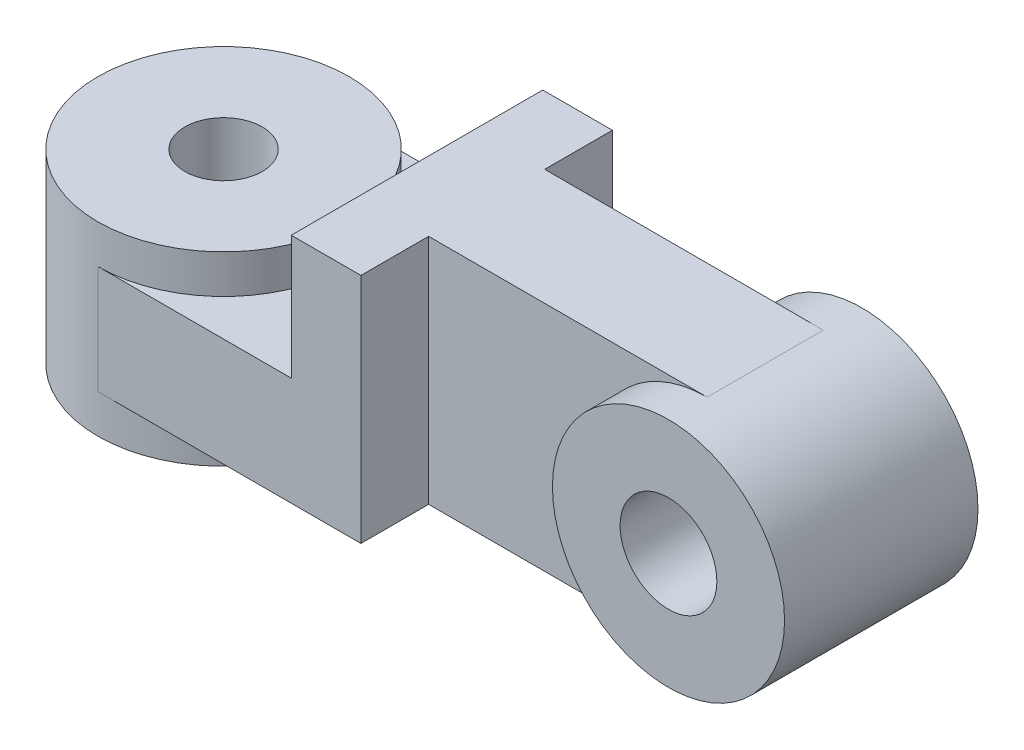
ISO-10303-21;
HEADER;
FILE_DESCRIPTION(('STEP AP214'),'2;1');
FILE_NAME('part.step','',(''),(''),'','','');
FILE_SCHEMA(('AUTOMOTIVE_DESIGN { 1 0 10303 214 1 1 1 1 }'));
ENDSEC;
DATA;
#1=APPLICATION_CONTEXT('core data for automotive mechanical design processes');
#2=APPLICATION_PROTOCOL_DEFINITION('international standard','automotive_design',2000,#1);
#3=PRODUCT_CONTEXT('',#1,'mechanical');
#4=PRODUCT('Part','Part','',(#3));
#5=PRODUCT_RELATED_PRODUCT_CATEGORY('part','',(#4));
#6=PRODUCT_DEFINITION_FORMATION('','',#4);
#7=PRODUCT_DEFINITION_CONTEXT('part definition',#1,'design');
#8=PRODUCT_DEFINITION('design','',#6,#7);
#9=PRODUCT_DEFINITION_SHAPE('','',#8);
#10=(LENGTH_UNIT() NAMED_UNIT(*) SI_UNIT(.MILLI.,.METRE.));
#11=(NAMED_UNIT(*) PLANE_ANGLE_UNIT() SI_UNIT($,.RADIAN.));
#12=(NAMED_UNIT(*) SI_UNIT($,.STERADIAN.) SOLID_ANGLE_UNIT());
#13=UNCERTAINTY_MEASURE_WITH_UNIT(LENGTH_MEASURE(1.E-05),#10,'distance_accuracy_value','');
#14=(GEOMETRIC_REPRESENTATION_CONTEXT(3) GLOBAL_UNCERTAINTY_ASSIGNED_CONTEXT((#13)) GLOBAL_UNIT_ASSIGNED_CONTEXT((#10,
#11,#12)) REPRESENTATION_CONTEXT('',''));
#15=CARTESIAN_POINT('',(0.,0.,0.));
#16=DIRECTION('',(0.,0.,1.));
#17=DIRECTION('',(1.,0.,0.));
#18=AXIS2_PLACEMENT_3D('',#15,#16,#17);
#19=CARTESIAN_POINT('',(0.,0.,32.5));
#20=DIRECTION('',(1.,0.,0.));
#21=DIRECTION('',(0.,1.,0.));
#22=AXIS2_PLACEMENT_3D('',#19,#20,#21);
#23=PLANE('',#22);
#24=DIRECTION('',(0.,0.,-1.));
#25=VECTOR('',#24,1.);
#26=CARTESIAN_POINT('',(0.,60.,32.5));
#27=LINE('',#26,#25);
#28=CARTESIAN_POINT('',(0.,60.,-15.));
#29=VERTEX_POINT('',#28);
#30=CARTESIAN_POINT('',(0.,60.,-32.5));
#31=VERTEX_POINT('',#30);
#32=EDGE_CURVE('E56',#29,#31,#27,.T.);
#33=ORIENTED_EDGE('',*,*,#32,.F.);
#34=DIRECTION('',(0.,-1.,0.));
#35=VECTOR('',#34,1.);
#36=CARTESIAN_POINT('',(0.,0.,-15.));
#37=LINE('',#36,#35);
#38=CARTESIAN_POINT('',(0.,0.,-15.));
#39=VERTEX_POINT('',#38);
#40=EDGE_CURVE('E51',#29,#39,#37,.T.);
#41=ORIENTED_EDGE('',*,*,#40,.T.);
#42=DIRECTION('',(0.,0.,-1.));
#43=VECTOR('',#42,1.);
#44=CARTESIAN_POINT('',(0.,0.,32.5));
#45=LINE('',#44,#43);
#46=CARTESIAN_POINT('',(0.,0.,-32.5));
#47=VERTEX_POINT('',#46);
#48=EDGE_CURVE('E182',#39,#47,#45,.T.);
#49=ORIENTED_EDGE('',*,*,#48,.T.);
#50=DIRECTION('',(0.,-1.,0.));
#51=VECTOR('',#50,1.);
#52=CARTESIAN_POINT('',(0.,0.,-32.5));
#53=LINE('',#52,#51);
#54=EDGE_CURVE('E163',#31,#47,#53,.T.);
#55=ORIENTED_EDGE('',*,*,#54,.F.);
#56=EDGE_LOOP('',(#33,#41,#49,#55));
#57=FACE_BOUND('',#56,.T.);
#58=ADVANCED_FACE('F35',(#57),#23,.T.);
#59=CARTESIAN_POINT('',(0.,0.,32.5));
#60=DIRECTION('',(0.,-1.,0.));
#61=DIRECTION('',(0.,0.,-1.));
#62=AXIS2_PLACEMENT_3D('',#59,#60,#61);
#63=PLANE('',#62);
#64=CARTESIAN_POINT('',(-68.,0.,0.));
#65=DIRECTION('',(0.,-1.,0.));
#66=DIRECTION('',(0.,0.,-1.));
#67=AXIS2_PLACEMENT_3D('',#64,#65,#66);
#68=CIRCLE('',#67,32.5);
#69=CARTESIAN_POINT('',(-68.,0.,-32.5));
#70=VERTEX_POINT('',#69);
#71=CARTESIAN_POINT('',(-68.,0.,32.5));
#72=VERTEX_POINT('',#71);
#73=EDGE_CURVE('E136',#70,#72,#68,.T.);
#74=ORIENTED_EDGE('',*,*,#73,.F.);
#75=DIRECTION('',(-1.,0.,0.));
#76=VECTOR('',#75,1.);
#77=CARTESIAN_POINT('',(0.,0.,-32.5));
#78=LINE('',#77,#76);
#79=EDGE_CURVE('E141',#47,#70,#78,.T.);
#80=ORIENTED_EDGE('',*,*,#79,.F.);
#81=ORIENTED_EDGE('',*,*,#48,.F.);
#82=DIRECTION('',(-1.,0.,0.));
#83=VECTOR('',#82,1.);
#84=CARTESIAN_POINT('',(0.,0.,-15.));
#85=LINE('',#84,#83);
#86=CARTESIAN_POINT('',(72.,0.,-15.));
#87=VERTEX_POINT('',#86);
#88=EDGE_CURVE('E132',#87,#39,#85,.T.);
#89=ORIENTED_EDGE('',*,*,#88,.F.);
#90=DIRECTION('',(0.,0.,-1.));
#91=VECTOR('',#90,1.);
#92=CARTESIAN_POINT('',(72.,0.,15.));
#93=LINE('',#92,#91);
#94=CARTESIAN_POINT('',(72.,0.,15.));
#95=VERTEX_POINT('',#94);
#96=EDGE_CURVE('E115',#95,#87,#93,.T.);
#97=ORIENTED_EDGE('',*,*,#96,.F.);
#98=DIRECTION('',(-1.,0.,0.));
#99=VECTOR('',#98,1.);
#100=CARTESIAN_POINT('',(0.,0.,15.));
#101=LINE('',#100,#99);
#102=CARTESIAN_POINT('',(0.,0.,15.));
#103=VERTEX_POINT('',#102);
#104=EDGE_CURVE('E134',#95,#103,#101,.T.);
#105=ORIENTED_EDGE('',*,*,#104,.T.);
#106=CARTESIAN_POINT('',(0.,0.,32.5));
#107=VERTEX_POINT('',#106);
#108=EDGE_CURVE('E44',#107,#103,#45,.T.);
#109=ORIENTED_EDGE('',*,*,#108,.F.);
#110=DIRECTION('',(-1.,0.,0.));
#111=VECTOR('',#110,1.);
#112=CARTESIAN_POINT('',(0.,0.,32.5));
#113=LINE('',#112,#111);
#114=EDGE_CURVE('E142',#107,#72,#113,.T.);
#115=ORIENTED_EDGE('',*,*,#114,.T.);
#116=EDGE_LOOP('',(#74,#80,#81,#89,#97,#105,#109,#115));
#117=FACE_BOUND('',#116,.T.);
#118=ADVANCED_FACE('F37',(#117),#63,.T.);
#119=DIRECTION('',(0.,-1.,0.));
#120=VECTOR('',#119,1.);
#121=CARTESIAN_POINT('',(0.,0.,15.));
#122=LINE('',#121,#120);
#123=CARTESIAN_POINT('',(0.,60.,15.));
#124=VERTEX_POINT('',#123);
#125=EDGE_CURVE('E129',#124,#103,#122,.T.);
#126=ORIENTED_EDGE('',*,*,#125,.F.);
#127=CARTESIAN_POINT('',(0.,60.,32.5));
#128=VERTEX_POINT('',#127);
#129=EDGE_CURVE('E180',#128,#124,#27,.T.);
#130=ORIENTED_EDGE('',*,*,#129,.F.);
#131=DIRECTION('',(0.,-1.,0.));
#132=VECTOR('',#131,1.);
#133=CARTESIAN_POINT('',(0.,0.,32.5));
#134=LINE('',#133,#132);
#135=EDGE_CURVE('E145',#128,#107,#134,.T.);
#136=ORIENTED_EDGE('',*,*,#135,.T.);
#137=ORIENTED_EDGE('',*,*,#108,.T.);
#138=EDGE_LOOP('',(#126,#130,#136,#137));
#139=FACE_BOUND('',#138,.T.);
#140=ADVANCED_FACE('F217',(#139),#23,.T.);
#141=CARTESIAN_POINT('',(0.,60.,32.5));
#142=DIRECTION('',(0.,1.,0.));
#143=DIRECTION('',(0.,0.,1.));
#144=AXIS2_PLACEMENT_3D('',#141,#142,#143);
#145=PLANE('',#144);
#146=DIRECTION('',(1.,0.,0.));
#147=VECTOR('',#146,1.);
#148=CARTESIAN_POINT('',(0.,60.,-32.5));
#149=LINE('',#148,#147);
#150=CARTESIAN_POINT('',(-18.,60.,-32.5));
#151=VERTEX_POINT('',#150);
#152=EDGE_CURVE('E166',#151,#31,#149,.T.);
#153=ORIENTED_EDGE('',*,*,#152,.F.);
#154=DIRECTION('',(0.,0.,-1.));
#155=VECTOR('',#154,1.);
#156=CARTESIAN_POINT('',(-18.,60.,32.5));
#157=LINE('',#156,#155);
#158=CARTESIAN_POINT('',(-18.,60.,32.5));
#159=VERTEX_POINT('',#158);
#160=EDGE_CURVE('E178',#159,#151,#157,.T.);
#161=ORIENTED_EDGE('',*,*,#160,.F.);
#162=DIRECTION('',(1.,0.,0.));
#163=VECTOR('',#162,1.);
#164=CARTESIAN_POINT('',(0.,60.,32.5));
#165=LINE('',#164,#163);
#166=EDGE_CURVE('E149',#159,#128,#165,.T.);
#167=ORIENTED_EDGE('',*,*,#166,.T.);
#168=ORIENTED_EDGE('',*,*,#129,.T.);
#169=DIRECTION('',(1.,0.,0.));
#170=VECTOR('',#169,1.);
#171=CARTESIAN_POINT('',(0.,60.,15.));
#172=LINE('',#171,#170);
#173=CARTESIAN_POINT('',(72.,60.,15.));
#174=VERTEX_POINT('',#173);
#175=EDGE_CURVE('E128',#124,#174,#172,.T.);
#176=ORIENTED_EDGE('',*,*,#175,.T.);
#177=DIRECTION('',(0.,0.,-1.));
#178=VECTOR('',#177,1.);
#179=CARTESIAN_POINT('',(72.,60.,15.));
#180=LINE('',#179,#178);
#181=CARTESIAN_POINT('',(72.,60.,-15.));
#182=VERTEX_POINT('',#181);
#183=EDGE_CURVE('E112',#174,#182,#180,.T.);
#184=ORIENTED_EDGE('',*,*,#183,.T.);
#185=DIRECTION('',(1.,0.,0.));
#186=VECTOR('',#185,1.);
#187=CARTESIAN_POINT('',(0.,60.,-15.));
#188=LINE('',#187,#186);
#189=EDGE_CURVE('E125',#29,#182,#188,.T.);
#190=ORIENTED_EDGE('',*,*,#189,.F.);
#191=ORIENTED_EDGE('',*,*,#32,.T.);
#192=EDGE_LOOP('',(#153,#161,#167,#168,#176,#184,#190,#191));
#193=FACE_BOUND('',#192,.T.);
#194=ADVANCED_FACE('F124',(#193),#145,.T.);
#195=CARTESIAN_POINT('',(-18.,0.,32.5));
#196=DIRECTION('',(-1.,0.,0.));
#197=DIRECTION('',(0.,-1.,0.));
#198=AXIS2_PLACEMENT_3D('',#195,#196,#197);
#199=PLANE('',#198);
#200=DIRECTION('',(0.,1.,0.));
#201=VECTOR('',#200,1.);
#202=CARTESIAN_POINT('',(-18.,0.,-32.5));
#203=LINE('',#202,#201);
#204=CARTESIAN_POINT('',(-18.,28.,-32.5));
#205=VERTEX_POINT('',#204);
#206=EDGE_CURVE('E169',#205,#151,#203,.T.);
#207=ORIENTED_EDGE('',*,*,#206,.F.);
#208=DIRECTION('',(0.,0.,-1.));
#209=VECTOR('',#208,1.);
#210=CARTESIAN_POINT('',(-18.,28.,32.5));
#211=LINE('',#210,#209);
#212=CARTESIAN_POINT('',(-18.,28.,32.5));
#213=VERTEX_POINT('',#212);
#214=EDGE_CURVE('E160',#213,#205,#211,.T.);
#215=ORIENTED_EDGE('',*,*,#214,.F.);
#216=DIRECTION('',(0.,1.,0.));
#217=VECTOR('',#216,1.);
#218=CARTESIAN_POINT('',(-18.,0.,32.5));
#219=LINE('',#218,#217);
#220=EDGE_CURVE('E152',#213,#159,#219,.T.);
#221=ORIENTED_EDGE('',*,*,#220,.T.);
#222=ORIENTED_EDGE('',*,*,#160,.T.);
#223=EDGE_LOOP('',(#207,#215,#221,#222));
#224=FACE_BOUND('',#223,.T.);
#225=ADVANCED_FACE('F199',(#224),#199,.T.);
#226=CARTESIAN_POINT('',(0.,28.,32.5));
#227=DIRECTION('',(0.,1.,0.));
#228=DIRECTION('',(0.,0.,1.));
#229=AXIS2_PLACEMENT_3D('',#226,#227,#228);
#230=PLANE('',#229);
#231=CARTESIAN_POINT('',(-68.,28.,0.));
#232=DIRECTION('',(0.,1.,0.));
#233=DIRECTION('',(0.,0.,1.));
#234=AXIS2_PLACEMENT_3D('',#231,#232,#233);
#235=CIRCLE('',#234,32.5);
#236=CARTESIAN_POINT('',(-68.,28.,32.5));
#237=VERTEX_POINT('',#236);
#238=CARTESIAN_POINT('',(-68.,28.,-32.5));
#239=VERTEX_POINT('',#238);
#240=EDGE_CURVE('E204',#237,#239,#235,.T.);
#241=ORIENTED_EDGE('',*,*,#240,.F.);
#242=DIRECTION('',(1.,0.,0.));
#243=VECTOR('',#242,1.);
#244=CARTESIAN_POINT('',(0.,28.,32.5));
#245=LINE('',#244,#243);
#246=EDGE_CURVE('E155',#237,#213,#245,.T.);
#247=ORIENTED_EDGE('',*,*,#246,.T.);
#248=ORIENTED_EDGE('',*,*,#214,.T.);
#249=DIRECTION('',(1.,0.,0.));
#250=VECTOR('',#249,1.);
#251=CARTESIAN_POINT('',(0.,28.,-32.5));
#252=LINE('',#251,#250);
#253=EDGE_CURVE('E172',#239,#205,#252,.T.);
#254=ORIENTED_EDGE('',*,*,#253,.F.);
#255=EDGE_LOOP('',(#241,#247,#248,#254));
#256=FACE_BOUND('',#255,.T.);
#257=ADVANCED_FACE('F203',(#256),#230,.T.);
#258=CARTESIAN_POINT('',(0.,0.,32.5));
#259=DIRECTION('',(0.,0.,1.));
#260=DIRECTION('',(1.,0.,0.));
#261=AXIS2_PLACEMENT_3D('',#258,#259,#260);
#262=PLANE('',#261);
#263=ORIENTED_EDGE('',*,*,#114,.F.);
#264=ORIENTED_EDGE('',*,*,#135,.F.);
#265=ORIENTED_EDGE('',*,*,#166,.F.);
#266=ORIENTED_EDGE('',*,*,#220,.F.);
#267=ORIENTED_EDGE('',*,*,#246,.F.);
#268=DIRECTION('',(0.,1.,0.));
#269=VECTOR('',#268,1.);
#270=CARTESIAN_POINT('',(-68.,0.,32.5));
#271=LINE('',#270,#269);
#272=EDGE_CURVE('E158',#72,#237,#271,.T.);
#273=ORIENTED_EDGE('',*,*,#272,.F.);
#274=EDGE_LOOP('',(#263,#264,#265,#266,#267,#273));
#275=FACE_BOUND('',#274,.T.);
#276=ADVANCED_FACE('F197',(#275),#262,.T.);
#277=CARTESIAN_POINT('',(0.,0.,-32.5));
#278=DIRECTION('',(0.,0.,1.));
#279=DIRECTION('',(1.,0.,0.));
#280=AXIS2_PLACEMENT_3D('',#277,#278,#279);
#281=PLANE('',#280);
#282=ORIENTED_EDGE('',*,*,#79,.T.);
#283=DIRECTION('',(0.,1.,0.));
#284=VECTOR('',#283,1.);
#285=CARTESIAN_POINT('',(-68.,0.,-32.5));
#286=LINE('',#285,#284);
#287=EDGE_CURVE('E146',#70,#239,#286,.T.);
#288=ORIENTED_EDGE('',*,*,#287,.T.);
#289=ORIENTED_EDGE('',*,*,#253,.T.);
#290=ORIENTED_EDGE('',*,*,#206,.T.);
#291=ORIENTED_EDGE('',*,*,#152,.T.);
#292=ORIENTED_EDGE('',*,*,#54,.T.);
#293=EDGE_LOOP('',(#282,#288,#289,#290,#291,#292));
#294=FACE_BOUND('',#293,.T.);
#295=ADVANCED_FACE('F189',(#294),#281,.F.);
#296=CARTESIAN_POINT('',(0.,0.,15.));
#297=DIRECTION('',(0.,0.,1.));
#298=DIRECTION('',(1.,0.,0.));
#299=AXIS2_PLACEMENT_3D('',#296,#297,#298);
#300=PLANE('',#299);
#301=CARTESIAN_POINT('',(72.,30.,15.));
#302=DIRECTION('',(0.,0.,1.));
#303=DIRECTION('',(1.,0.,0.));
#304=AXIS2_PLACEMENT_3D('',#301,#302,#303);
#305=CIRCLE('',#304,30.);
#306=EDGE_CURVE('E400',#174,#95,#305,.T.);
#307=ORIENTED_EDGE('',*,*,#306,.F.);
#308=ORIENTED_EDGE('',*,*,#175,.F.);
#309=ORIENTED_EDGE('',*,*,#125,.T.);
#310=ORIENTED_EDGE('',*,*,#104,.F.);
#311=EDGE_LOOP('',(#307,#308,#309,#310));
#312=FACE_BOUND('',#311,.T.);
#313=ADVANCED_FACE('F216',(#312),#300,.T.);
#314=CARTESIAN_POINT('',(0.,0.,-15.));
#315=DIRECTION('',(0.,0.,1.));
#316=DIRECTION('',(1.,0.,0.));
#317=AXIS2_PLACEMENT_3D('',#314,#315,#316);
#318=PLANE('',#317);
#319=ORIENTED_EDGE('',*,*,#189,.T.);
#320=CARTESIAN_POINT('',(72.,30.,-15.));
#321=DIRECTION('',(0.,0.,1.));
#322=DIRECTION('',(1.,0.,0.));
#323=AXIS2_PLACEMENT_3D('',#320,#321,#322);
#324=CIRCLE('',#323,30.);
#325=EDGE_CURVE('E11',#182,#87,#324,.T.);
#326=ORIENTED_EDGE('',*,*,#325,.T.);
#327=ORIENTED_EDGE('',*,*,#88,.T.);
#328=ORIENTED_EDGE('',*,*,#40,.F.);
#329=EDGE_LOOP('',(#319,#326,#327,#328));
#330=FACE_BOUND('',#329,.T.);
#331=ADVANCED_FACE('F131',(#330),#318,.F.);
#332=CARTESIAN_POINT('',(-68.,-10.,0.));
#333=DIRECTION('',(0.,1.,0.));
#334=DIRECTION('',(0.,0.,1.));
#335=AXIS2_PLACEMENT_3D('',#332,#333,#334);
#336=CYLINDRICAL_SURFACE('',#335,32.5);
#337=ORIENTED_EDGE('',*,*,#73,.T.);
#338=ORIENTED_EDGE('',*,*,#272,.T.);
#339=ORIENTED_EDGE('',*,*,#240,.T.);
#340=ORIENTED_EDGE('',*,*,#287,.F.);
#341=EDGE_LOOP('',(#337,#338,#339,#340));
#342=FACE_BOUND('',#341,.T.);
#343=CARTESIAN_POINT('',(-68.,-10.,0.));
#344=DIRECTION('',(0.,1.,0.));
#345=DIRECTION('',(0.,0.,1.));
#346=AXIS2_PLACEMENT_3D('',#343,#344,#345);
#347=CIRCLE('',#346,32.5);
#348=CARTESIAN_POINT('',(-68.,-10.,32.5));
#349=VERTEX_POINT('',#348);
#350=EDGE_CURVE('E405',#349,#349,#347,.T.);
#351=ORIENTED_EDGE('',*,*,#350,.T.);
#352=EDGE_LOOP('',(#351));
#353=FACE_BOUND('',#352,.T.);
#354=CARTESIAN_POINT('',(-68.,38.,0.));
#355=DIRECTION('',(0.,1.,0.));
#356=DIRECTION('',(0.,0.,1.));
#357=AXIS2_PLACEMENT_3D('',#354,#355,#356);
#358=CIRCLE('',#357,32.5);
#359=CARTESIAN_POINT('',(-68.,38.,32.5));
#360=VERTEX_POINT('',#359);
#361=EDGE_CURVE('E404',#360,#360,#358,.T.);
#362=ORIENTED_EDGE('',*,*,#361,.F.);
#363=EDGE_LOOP('',(#362));
#364=FACE_BOUND('',#363,.T.);
#365=ADVANCED_FACE('F207',(#342,#353,#364),#336,.T.);
#366=CARTESIAN_POINT('',(-68.,-10.,0.));
#367=DIRECTION('',(0.,1.,0.));
#368=DIRECTION('',(0.,0.,1.));
#369=AXIS2_PLACEMENT_3D('',#366,#367,#368);
#370=PLANE('',#369);
#371=CARTESIAN_POINT('',(-68.,-10.,0.));
#372=DIRECTION('',(0.,1.,0.));
#373=DIRECTION('',(0.,0.,1.));
#374=AXIS2_PLACEMENT_3D('',#371,#372,#373);
#375=CIRCLE('',#374,10.);
#376=CARTESIAN_POINT('',(-68.,-10.,10.));
#377=VERTEX_POINT('',#376);
#378=EDGE_CURVE('E391',#377,#377,#375,.T.);
#379=ORIENTED_EDGE('',*,*,#378,.T.);
#380=EDGE_LOOP('',(#379));
#381=FACE_BOUND('',#380,.T.);
#382=ORIENTED_EDGE('',*,*,#350,.F.);
#383=EDGE_LOOP('',(#382));
#384=FACE_BOUND('',#383,.T.);
#385=ADVANCED_FACE('F282',(#381,#384),#370,.F.);
#386=CARTESIAN_POINT('',(-68.,38.,0.));
#387=DIRECTION('',(0.,1.,0.));
#388=DIRECTION('',(0.,0.,1.));
#389=AXIS2_PLACEMENT_3D('',#386,#387,#388);
#390=PLANE('',#389);
#391=CARTESIAN_POINT('',(-68.,38.,0.));
#392=DIRECTION('',(0.,1.,0.));
#393=DIRECTION('',(0.,0.,1.));
#394=AXIS2_PLACEMENT_3D('',#391,#392,#393);
#395=CIRCLE('',#394,10.);
#396=CARTESIAN_POINT('',(-68.,38.,10.));
#397=VERTEX_POINT('',#396);
#398=EDGE_CURVE('E388',#397,#397,#395,.T.);
#399=ORIENTED_EDGE('',*,*,#398,.F.);
#400=EDGE_LOOP('',(#399));
#401=FACE_BOUND('',#400,.T.);
#402=ORIENTED_EDGE('',*,*,#361,.T.);
#403=EDGE_LOOP('',(#402));
#404=FACE_BOUND('',#403,.T.);
#405=ADVANCED_FACE('F273',(#401,#404),#390,.T.);
#406=CARTESIAN_POINT('',(72.,30.,-25.));
#407=DIRECTION('',(0.,0.,1.));
#408=DIRECTION('',(1.,0.,0.));
#409=AXIS2_PLACEMENT_3D('',#406,#407,#408);
#410=CYLINDRICAL_SURFACE('',#409,30.);
#411=ORIENTED_EDGE('',*,*,#183,.F.);
#412=ORIENTED_EDGE('',*,*,#306,.T.);
#413=ORIENTED_EDGE('',*,*,#96,.T.);
#414=ORIENTED_EDGE('',*,*,#325,.F.);
#415=EDGE_LOOP('',(#411,#412,#413,#414));
#416=FACE_BOUND('',#415,.T.);
#417=CARTESIAN_POINT('',(72.,30.,-25.));
#418=DIRECTION('',(0.,0.,1.));
#419=DIRECTION('',(1.,0.,0.));
#420=AXIS2_PLACEMENT_3D('',#417,#418,#419);
#421=CIRCLE('',#420,30.);
#422=CARTESIAN_POINT('',(102.,30.,-25.));
#423=VERTEX_POINT('',#422);
#424=EDGE_CURVE('E397',#423,#423,#421,.T.);
#425=ORIENTED_EDGE('',*,*,#424,.T.);
#426=EDGE_LOOP('',(#425));
#427=FACE_BOUND('',#426,.T.);
#428=CARTESIAN_POINT('',(72.,30.,25.));
#429=DIRECTION('',(0.,0.,1.));
#430=DIRECTION('',(1.,0.,0.));
#431=AXIS2_PLACEMENT_3D('',#428,#429,#430);
#432=CIRCLE('',#431,30.);
#433=CARTESIAN_POINT('',(102.,30.,25.));
#434=VERTEX_POINT('',#433);
#435=EDGE_CURVE('E395',#434,#434,#432,.T.);
#436=ORIENTED_EDGE('',*,*,#435,.F.);
#437=EDGE_LOOP('',(#436));
#438=FACE_BOUND('',#437,.T.);
#439=ADVANCED_FACE('F110',(#416,#427,#438),#410,.T.);
#440=CARTESIAN_POINT('',(72.,30.,-25.));
#441=DIRECTION('',(0.,0.,1.));
#442=DIRECTION('',(1.,0.,0.));
#443=AXIS2_PLACEMENT_3D('',#440,#441,#442);
#444=PLANE('',#443);
#445=CARTESIAN_POINT('',(72.,30.,-25.));
#446=DIRECTION('',(0.,0.,1.));
#447=DIRECTION('',(1.,0.,0.));
#448=AXIS2_PLACEMENT_3D('',#445,#446,#447);
#449=CIRCLE('',#448,12.5);
#450=CARTESIAN_POINT('',(84.5,30.,-25.));
#451=VERTEX_POINT('',#450);
#452=EDGE_CURVE('E387',#451,#451,#449,.T.);
#453=ORIENTED_EDGE('',*,*,#452,.T.);
#454=EDGE_LOOP('',(#453));
#455=FACE_BOUND('',#454,.T.);
#456=ORIENTED_EDGE('',*,*,#424,.F.);
#457=EDGE_LOOP('',(#456));
#458=FACE_BOUND('',#457,.T.);
#459=ADVANCED_FACE('F272',(#455,#458),#444,.F.);
#460=CARTESIAN_POINT('',(72.,30.,25.));
#461=DIRECTION('',(0.,0.,1.));
#462=DIRECTION('',(1.,0.,0.));
#463=AXIS2_PLACEMENT_3D('',#460,#461,#462);
#464=PLANE('',#463);
#465=CARTESIAN_POINT('',(72.,30.,25.));
#466=DIRECTION('',(0.,0.,1.));
#467=DIRECTION('',(1.,0.,0.));
#468=AXIS2_PLACEMENT_3D('',#465,#466,#467);
#469=CIRCLE('',#468,12.5);
#470=CARTESIAN_POINT('',(84.5,30.,25.));
#471=VERTEX_POINT('',#470);
#472=EDGE_CURVE('E39',#471,#471,#469,.T.);
#473=ORIENTED_EDGE('',*,*,#472,.F.);
#474=EDGE_LOOP('',(#473));
#475=FACE_BOUND('',#474,.T.);
#476=ORIENTED_EDGE('',*,*,#435,.T.);
#477=EDGE_LOOP('',(#476));
#478=FACE_BOUND('',#477,.T.);
#479=ADVANCED_FACE('F308',(#475,#478),#464,.T.);
#480=CARTESIAN_POINT('',(-68.,-10.,0.));
#481=DIRECTION('',(0.,1.,0.));
#482=DIRECTION('',(0.,0.,1.));
#483=AXIS2_PLACEMENT_3D('',#480,#481,#482);
#484=CYLINDRICAL_SURFACE('',#483,10.);
#485=ORIENTED_EDGE('',*,*,#378,.F.);
#486=EDGE_LOOP('',(#485));
#487=FACE_BOUND('',#486,.T.);
#488=ORIENTED_EDGE('',*,*,#398,.T.);
#489=EDGE_LOOP('',(#488));
#490=FACE_BOUND('',#489,.T.);
#491=ADVANCED_FACE('F302',(#487,#490),#484,.F.);
#492=CARTESIAN_POINT('',(72.,30.,-32.5));
#493=DIRECTION('',(0.,0.,1.));
#494=DIRECTION('',(1.,0.,0.));
#495=AXIS2_PLACEMENT_3D('',#492,#493,#494);
#496=CYLINDRICAL_SURFACE('',#495,12.5);
#497=CARTESIAN_POINT('',(84.5,30.,25.));
#498=CARTESIAN_POINT('',(84.5,30.,24.4791666666667));
#499=CARTESIAN_POINT('',(84.5,30.,23.9583333333333));
#500=CARTESIAN_POINT('',(84.5,30.,22.9166666666667));
#501=CARTESIAN_POINT('',(84.5,30.,22.3958333333333));
#502=CARTESIAN_POINT('',(84.5,30.,21.3541666666667));
#503=CARTESIAN_POINT('',(84.5,30.,20.8333333333333));
#504=CARTESIAN_POINT('',(84.5,30.,19.7916666666667));
#505=CARTESIAN_POINT('',(84.5,30.,19.2708333333333));
#506=CARTESIAN_POINT('',(84.5,30.,18.2291666666667));
#507=CARTESIAN_POINT('',(84.5,30.,17.7083333333333));
#508=CARTESIAN_POINT('',(84.5,30.,16.6666666666667));
#509=CARTESIAN_POINT('',(84.5,30.,16.1458333333333));
#510=CARTESIAN_POINT('',(84.5,30.,15.1041666666667));
#511=CARTESIAN_POINT('',(84.5,30.,14.5833333333333));
#512=CARTESIAN_POINT('',(84.5,30.,13.5416666666667));
#513=CARTESIAN_POINT('',(84.5,30.,13.0208333333333));
#514=CARTESIAN_POINT('',(84.5,30.,11.9791666666667));
#515=CARTESIAN_POINT('',(84.5,30.,11.4583333333333));
#516=CARTESIAN_POINT('',(84.5,30.,10.4166666666667));
#517=CARTESIAN_POINT('',(84.5,30.,9.89583333333333));
#518=CARTESIAN_POINT('',(84.5,30.,8.85416666666666));
#519=CARTESIAN_POINT('',(84.5,30.,8.33333333333333));
#520=CARTESIAN_POINT('',(84.5,30.,7.29166666666666));
#521=CARTESIAN_POINT('',(84.5,30.,6.77083333333333));
#522=CARTESIAN_POINT('',(84.5,30.,5.72916666666666));
#523=CARTESIAN_POINT('',(84.5,30.,5.20833333333333));
#524=CARTESIAN_POINT('',(84.5,30.,4.16666666666666));
#525=CARTESIAN_POINT('',(84.5,30.,3.64583333333333));
#526=CARTESIAN_POINT('',(84.5,30.,2.60416666666666));
#527=CARTESIAN_POINT('',(84.5,30.,2.08333333333333));
#528=CARTESIAN_POINT('',(84.5,30.,1.04166666666666));
#529=CARTESIAN_POINT('',(84.5,30.,0.520833333333327));
#530=CARTESIAN_POINT('',(84.5,30.,-0.52083333333334));
#531=CARTESIAN_POINT('',(84.5,30.,-1.04166666666667));
#532=CARTESIAN_POINT('',(84.5,30.,-2.08333333333334));
#533=CARTESIAN_POINT('',(84.5,30.,-2.60416666666667));
#534=CARTESIAN_POINT('',(84.5,30.,-3.64583333333334));
#535=CARTESIAN_POINT('',(84.5,30.,-4.16666666666667));
#536=CARTESIAN_POINT('',(84.5,30.,-5.20833333333334));
#537=CARTESIAN_POINT('',(84.5,30.,-5.72916666666667));
#538=CARTESIAN_POINT('',(84.5,30.,-6.77083333333334));
#539=CARTESIAN_POINT('',(84.5,30.,-7.29166666666667));
#540=CARTESIAN_POINT('',(84.5,30.,-8.33333333333334));
#541=CARTESIAN_POINT('',(84.5,30.,-8.85416666666667));
#542=CARTESIAN_POINT('',(84.5,30.,-9.89583333333334));
#543=CARTESIAN_POINT('',(84.5,30.,-10.4166666666667));
#544=CARTESIAN_POINT('',(84.5,30.,-11.4583333333333));
#545=CARTESIAN_POINT('',(84.5,30.,-11.9791666666667));
#546=CARTESIAN_POINT('',(84.5,30.,-13.0208333333333));
#547=CARTESIAN_POINT('',(84.5,30.,-13.5416666666667));
#548=CARTESIAN_POINT('',(84.5,30.,-14.5833333333333));
#549=CARTESIAN_POINT('',(84.5,30.,-15.1041666666667));
#550=CARTESIAN_POINT('',(84.5,30.,-16.1458333333333));
#551=CARTESIAN_POINT('',(84.5,30.,-16.6666666666667));
#552=CARTESIAN_POINT('',(84.5,30.,-17.7083333333333));
#553=CARTESIAN_POINT('',(84.5,30.,-18.2291666666667));
#554=CARTESIAN_POINT('',(84.5,30.,-19.2708333333333));
#555=CARTESIAN_POINT('',(84.5,30.,-19.7916666666667));
#556=CARTESIAN_POINT('',(84.5,30.,-20.8333333333333));
#557=CARTESIAN_POINT('',(84.5,30.,-21.3541666666667));
#558=CARTESIAN_POINT('',(84.5,30.,-22.3958333333333));
#559=CARTESIAN_POINT('',(84.5,30.,-22.9166666666667));
#560=CARTESIAN_POINT('',(84.5,30.,-23.9583333333333));
#561=CARTESIAN_POINT('',(84.5,30.,-24.4791666666667));
#562=CARTESIAN_POINT('',(84.5,30.,-25.));
#563=B_SPLINE_CURVE_WITH_KNOTS('',3,(#497,#498,#499,#500,#501,#502,#503,#504,#505,#506,#507,
#508,#509,#510,#511,#512,#513,#514,#515,#516,#517,#518,#519,#520,#521,#522,#523,#524,#525,#526,
#527,#528,#529,#530,#531,#532,#533,#534,#535,#536,#537,#538,#539,#540,#541,#542,#543,#544,#545,
#546,#547,#548,#549,#550,#551,#552,#553,#554,#555,#556,#557,#558,#559,#560,#561,#562),
.UNSPECIFIED.,.F.,.F.,(4,2,2,2,2,2,2,2,2,2,2,2,2,2,2,2,2,2,2,2,2,2,2,2,2,2,2,2,2,2,2,2,4),(0.,
1.5625,3.125,4.6875,6.25,7.8125,9.375,10.9375,12.5,14.0625,15.625,17.1875,18.75,20.3125,21.875,
23.4375,25.,26.5625,28.125,29.6875,31.25,32.8125,34.375,35.9375,37.5,39.0625,40.625,42.1875,
43.75,45.3125,46.875,48.4375,50.),.UNSPECIFIED.);
#564=EDGE_CURVE('BSEAM307',#471,#451,#563,.T.);
#565=ORIENTED_EDGE('',*,*,#472,.T.);
#566=ORIENTED_EDGE('',*,*,#452,.F.);
#567=ORIENTED_EDGE('',*,*,#564,.T.);
#568=ORIENTED_EDGE('',*,*,#564,.F.);
#569=EDGE_LOOP('',(#565,#567,#566,#568));
#570=FACE_BOUND('',#569,.T.);
#571=ADVANCED_FACE('F307',(#570),#496,.F.);
#572=CLOSED_SHELL('',(#58,#118,#140,#194,#225,#257,#276,#295,#313,#331,#365,#385,#405,#439,#459,
#479,#491,#571));
#573=MANIFOLD_SOLID_BREP('B2',#572);
#574=ADVANCED_BREP_SHAPE_REPRESENTATION('',(#18,#573),#14);
#575=SHAPE_DEFINITION_REPRESENTATION(#9,#574);
ENDSEC;
END-ISO-10303-21;
